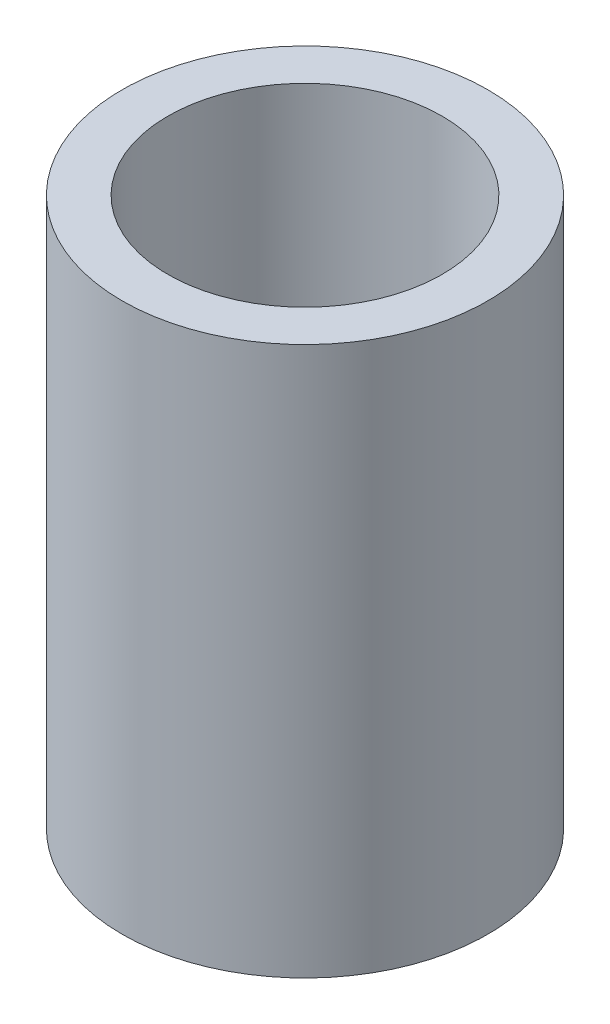
ISO-10303-21;
HEADER;
FILE_DESCRIPTION(('STEP AP214'),'2;1');
FILE_NAME('part.step','',(''),(''),'','','');
FILE_SCHEMA(('AUTOMOTIVE_DESIGN { 1 0 10303 214 1 1 1 1 }'));
ENDSEC;
DATA;
#1=APPLICATION_CONTEXT('core data for automotive mechanical design processes');
#2=APPLICATION_PROTOCOL_DEFINITION('international standard','automotive_design',2000,#1);
#3=PRODUCT_CONTEXT('',#1,'mechanical');
#4=PRODUCT('Part','Part','',(#3));
#5=PRODUCT_RELATED_PRODUCT_CATEGORY('part','',(#4));
#6=PRODUCT_DEFINITION_FORMATION('','',#4);
#7=PRODUCT_DEFINITION_CONTEXT('part definition',#1,'design');
#8=PRODUCT_DEFINITION('design','',#6,#7);
#9=PRODUCT_DEFINITION_SHAPE('','',#8);
#10=(LENGTH_UNIT() NAMED_UNIT(*) SI_UNIT(.MILLI.,.METRE.));
#11=(NAMED_UNIT(*) PLANE_ANGLE_UNIT() SI_UNIT($,.RADIAN.));
#12=(NAMED_UNIT(*) SI_UNIT($,.STERADIAN.) SOLID_ANGLE_UNIT());
#13=UNCERTAINTY_MEASURE_WITH_UNIT(LENGTH_MEASURE(1.E-05),#10,'distance_accuracy_value','');
#14=(GEOMETRIC_REPRESENTATION_CONTEXT(3) GLOBAL_UNCERTAINTY_ASSIGNED_CONTEXT((#13)) GLOBAL_UNIT_ASSIGNED_CONTEXT((#10,
#11,#12)) REPRESENTATION_CONTEXT('',''));
#15=CARTESIAN_POINT('',(0.,0.,0.));
#16=DIRECTION('',(0.,0.,1.));
#17=DIRECTION('',(1.,0.,0.));
#18=AXIS2_PLACEMENT_3D('',#15,#16,#17);
#19=CARTESIAN_POINT('',(0.,38.1,0.));
#20=DIRECTION('',(0.,1.,0.));
#21=DIRECTION('',(0.,0.,1.));
#22=AXIS2_PLACEMENT_3D('',#19,#20,#21);
#23=PLANE('',#22);
#24=CARTESIAN_POINT('',(0.,38.1,0.));
#25=DIRECTION('',(0.,1.,0.));
#26=DIRECTION('',(0.,0.,1.));
#27=AXIS2_PLACEMENT_3D('',#24,#25,#26);
#28=CIRCLE('',#27,12.7);
#29=CARTESIAN_POINT('',(0.,38.1,-12.7));
#30=VERTEX_POINT('',#29);
#31=EDGE_CURVE('E10',#30,#30,#28,.T.);
#32=ORIENTED_EDGE('',*,*,#31,.T.);
#33=EDGE_LOOP('',(#32));
#34=FACE_BOUND('',#33,.T.);
#35=CARTESIAN_POINT('',(0.,38.1,0.));
#36=DIRECTION('',(0.,1.,0.));
#37=DIRECTION('',(0.,0.,1.));
#38=AXIS2_PLACEMENT_3D('',#35,#36,#37);
#39=CIRCLE('',#38,9.52500000000002);
#40=CARTESIAN_POINT('',(0.,38.1,-9.52500000000002));
#41=VERTEX_POINT('',#40);
#42=EDGE_CURVE('E43',#41,#41,#39,.T.);
#43=ORIENTED_EDGE('',*,*,#42,.F.);
#44=EDGE_LOOP('',(#43));
#45=FACE_BOUND('',#44,.T.);
#46=ADVANCED_FACE('F32',(#34,#45),#23,.T.);
#47=CARTESIAN_POINT('',(0.,0.,0.));
#48=DIRECTION('',(0.,1.,0.));
#49=DIRECTION('',(0.,0.,1.));
#50=AXIS2_PLACEMENT_3D('',#47,#48,#49);
#51=PLANE('',#50);
#52=CARTESIAN_POINT('',(0.,0.,0.));
#53=DIRECTION('',(0.,1.,0.));
#54=DIRECTION('',(0.,0.,1.));
#55=AXIS2_PLACEMENT_3D('',#52,#53,#54);
#56=CIRCLE('',#55,12.7);
#57=CARTESIAN_POINT('',(0.,0.,-12.7));
#58=VERTEX_POINT('',#57);
#59=EDGE_CURVE('E36',#58,#58,#56,.T.);
#60=ORIENTED_EDGE('',*,*,#59,.F.);
#61=EDGE_LOOP('',(#60));
#62=FACE_BOUND('',#61,.T.);
#63=CARTESIAN_POINT('',(0.,0.,0.));
#64=DIRECTION('',(0.,1.,0.));
#65=DIRECTION('',(0.,0.,1.));
#66=AXIS2_PLACEMENT_3D('',#63,#64,#65);
#67=CIRCLE('',#66,9.52500000000002);
#68=CARTESIAN_POINT('',(0.,0.,-9.52500000000002));
#69=VERTEX_POINT('',#68);
#70=EDGE_CURVE('E45',#69,#69,#67,.T.);
#71=ORIENTED_EDGE('',*,*,#70,.T.);
#72=EDGE_LOOP('',(#71));
#73=FACE_BOUND('',#72,.T.);
#74=ADVANCED_FACE('F55',(#62,#73),#51,.F.);
#75=CARTESIAN_POINT('',(0.,38.1,0.));
#76=DIRECTION('',(0.,-1.,0.));
#77=DIRECTION('',(0.,0.,-1.));
#78=AXIS2_PLACEMENT_3D('',#75,#76,#77);
#79=CYLINDRICAL_SURFACE('',#78,12.7);
#80=CARTESIAN_POINT('',(0.,38.1,-12.7));
#81=CARTESIAN_POINT('',(0.,37.703125,-12.7));
#82=CARTESIAN_POINT('',(0.,37.30625,-12.7));
#83=CARTESIAN_POINT('',(0.,36.5125,-12.7));
#84=CARTESIAN_POINT('',(0.,36.115625,-12.7));
#85=CARTESIAN_POINT('',(0.,35.321875,-12.7));
#86=CARTESIAN_POINT('',(0.,34.925,-12.7));
#87=CARTESIAN_POINT('',(0.,34.13125,-12.7));
#88=CARTESIAN_POINT('',(0.,33.734375,-12.7));
#89=CARTESIAN_POINT('',(0.,32.940625,-12.7));
#90=CARTESIAN_POINT('',(0.,32.54375,-12.7));
#91=CARTESIAN_POINT('',(0.,31.75,-12.7));
#92=CARTESIAN_POINT('',(0.,31.353125,-12.7));
#93=CARTESIAN_POINT('',(0.,30.559375,-12.7));
#94=CARTESIAN_POINT('',(0.,30.1625,-12.7));
#95=CARTESIAN_POINT('',(0.,29.36875,-12.7));
#96=CARTESIAN_POINT('',(0.,28.971875,-12.7));
#97=CARTESIAN_POINT('',(0.,28.178125,-12.7));
#98=CARTESIAN_POINT('',(0.,27.78125,-12.7));
#99=CARTESIAN_POINT('',(0.,26.9875,-12.7));
#100=CARTESIAN_POINT('',(0.,26.590625,-12.7));
#101=CARTESIAN_POINT('',(0.,25.796875,-12.7));
#102=CARTESIAN_POINT('',(0.,25.4,-12.7));
#103=CARTESIAN_POINT('',(0.,24.60625,-12.7));
#104=CARTESIAN_POINT('',(0.,24.209375,-12.7));
#105=CARTESIAN_POINT('',(0.,23.415625,-12.7));
#106=CARTESIAN_POINT('',(0.,23.01875,-12.7));
#107=CARTESIAN_POINT('',(0.,22.225,-12.7));
#108=CARTESIAN_POINT('',(0.,21.828125,-12.7));
#109=CARTESIAN_POINT('',(0.,21.034375,-12.7));
#110=CARTESIAN_POINT('',(0.,20.6375,-12.7));
#111=CARTESIAN_POINT('',(0.,19.84375,-12.7));
#112=CARTESIAN_POINT('',(0.,19.446875,-12.7));
#113=CARTESIAN_POINT('',(0.,18.653125,-12.7));
#114=CARTESIAN_POINT('',(0.,18.25625,-12.7));
#115=CARTESIAN_POINT('',(0.,17.4625,-12.7));
#116=CARTESIAN_POINT('',(0.,17.065625,-12.7));
#117=CARTESIAN_POINT('',(0.,16.271875,-12.7));
#118=CARTESIAN_POINT('',(0.,15.875,-12.7));
#119=CARTESIAN_POINT('',(0.,15.08125,-12.7));
#120=CARTESIAN_POINT('',(0.,14.684375,-12.7));
#121=CARTESIAN_POINT('',(0.,13.890625,-12.7));
#122=CARTESIAN_POINT('',(0.,13.49375,-12.7));
#123=CARTESIAN_POINT('',(0.,12.7,-12.7));
#124=CARTESIAN_POINT('',(0.,12.303125,-12.7));
#125=CARTESIAN_POINT('',(0.,11.509375,-12.7));
#126=CARTESIAN_POINT('',(0.,11.1125,-12.7));
#127=CARTESIAN_POINT('',(0.,10.31875,-12.7));
#128=CARTESIAN_POINT('',(0.,9.92187499999999,-12.7));
#129=CARTESIAN_POINT('',(0.,9.128125,-12.7));
#130=CARTESIAN_POINT('',(0.,8.73124999999999,-12.7));
#131=CARTESIAN_POINT('',(0.,7.93749999999999,-12.7));
#132=CARTESIAN_POINT('',(0.,7.54062499999999,-12.7));
#133=CARTESIAN_POINT('',(0.,6.746875,-12.7));
#134=CARTESIAN_POINT('',(0.,6.35,-12.7));
#135=CARTESIAN_POINT('',(0.,5.55625,-12.7));
#136=CARTESIAN_POINT('',(0.,5.159375,-12.7));
#137=CARTESIAN_POINT('',(0.,4.365625,-12.7));
#138=CARTESIAN_POINT('',(0.,3.96875,-12.7));
#139=CARTESIAN_POINT('',(0.,3.175,-12.7));
#140=CARTESIAN_POINT('',(0.,2.778125,-12.7));
#141=CARTESIAN_POINT('',(0.,1.984375,-12.7));
#142=CARTESIAN_POINT('',(0.,1.5875,-12.7));
#143=CARTESIAN_POINT('',(0.,0.79375,-12.7));
#144=CARTESIAN_POINT('',(0.,0.396875,-12.7));
#145=CARTESIAN_POINT('',(0.,0.,-12.7));
#146=B_SPLINE_CURVE_WITH_KNOTS('',3,(#80,#81,#82,#83,#84,#85,#86,#87,#88,#89,#90,#91,#92,#93,
#94,#95,#96,#97,#98,#99,#100,#101,#102,#103,#104,#105,#106,#107,#108,#109,#110,#111,#112,#113,
#114,#115,#116,#117,#118,#119,#120,#121,#122,#123,#124,#125,#126,#127,#128,#129,#130,#131,#132,
#133,#134,#135,#136,#137,#138,#139,#140,#141,#142,#143,#144,#145),.UNSPECIFIED.,.F.,.F.,(4,2,2,
2,2,2,2,2,2,2,2,2,2,2,2,2,2,2,2,2,2,2,2,2,2,2,2,2,2,2,2,2,4),(0.,1.190625,2.38125,3.571875,
4.7625,5.953125,7.14375,8.334375,9.52500000000001,10.715625,11.90625,13.096875,14.2875,
15.478125,16.66875,17.859375,19.05,20.240625,21.43125,22.621875,23.8125,25.003125,26.19375,
27.384375,28.575,29.765625,30.95625,32.146875,33.3375,34.528125,35.71875,36.909375,38.1),.UNSPECIFIED.);
#147=EDGE_CURVE('BSEAM34',#30,#58,#146,.T.);
#148=ORIENTED_EDGE('',*,*,#31,.F.);
#149=ORIENTED_EDGE('',*,*,#59,.T.);
#150=ORIENTED_EDGE('',*,*,#147,.T.);
#151=ORIENTED_EDGE('',*,*,#147,.F.);
#152=EDGE_LOOP('',(#148,#150,#149,#151));
#153=FACE_BOUND('',#152,.T.);
#154=ADVANCED_FACE('F34',(#153),#79,.T.);
#155=CARTESIAN_POINT('',(0.,38.1,0.));
#156=DIRECTION('',(0.,-1.,0.));
#157=DIRECTION('',(0.,0.,-1.));
#158=AXIS2_PLACEMENT_3D('',#155,#156,#157);
#159=CYLINDRICAL_SURFACE('',#158,9.52500000000002);
#160=CARTESIAN_POINT('',(0.,38.1,-9.52500000000002));
#161=CARTESIAN_POINT('',(0.,37.703125,-9.52500000000002));
#162=CARTESIAN_POINT('',(0.,37.30625,-9.52500000000002));
#163=CARTESIAN_POINT('',(0.,36.5125,-9.52500000000002));
#164=CARTESIAN_POINT('',(0.,36.115625,-9.52500000000002));
#165=CARTESIAN_POINT('',(0.,35.321875,-9.52500000000002));
#166=CARTESIAN_POINT('',(0.,34.925,-9.52500000000002));
#167=CARTESIAN_POINT('',(0.,34.13125,-9.52500000000002));
#168=CARTESIAN_POINT('',(0.,33.734375,-9.52500000000002));
#169=CARTESIAN_POINT('',(0.,32.940625,-9.52500000000002));
#170=CARTESIAN_POINT('',(0.,32.54375,-9.52500000000002));
#171=CARTESIAN_POINT('',(0.,31.75,-9.52500000000002));
#172=CARTESIAN_POINT('',(0.,31.353125,-9.52500000000002));
#173=CARTESIAN_POINT('',(0.,30.559375,-9.52500000000002));
#174=CARTESIAN_POINT('',(0.,30.1625,-9.52500000000002));
#175=CARTESIAN_POINT('',(0.,29.36875,-9.52500000000002));
#176=CARTESIAN_POINT('',(0.,28.971875,-9.52500000000002));
#177=CARTESIAN_POINT('',(0.,28.178125,-9.52500000000002));
#178=CARTESIAN_POINT('',(0.,27.78125,-9.52500000000002));
#179=CARTESIAN_POINT('',(0.,26.9875,-9.52500000000002));
#180=CARTESIAN_POINT('',(0.,26.590625,-9.52500000000002));
#181=CARTESIAN_POINT('',(0.,25.796875,-9.52500000000002));
#182=CARTESIAN_POINT('',(0.,25.4,-9.52500000000002));
#183=CARTESIAN_POINT('',(0.,24.60625,-9.52500000000002));
#184=CARTESIAN_POINT('',(0.,24.209375,-9.52500000000002));
#185=CARTESIAN_POINT('',(0.,23.415625,-9.52500000000002));
#186=CARTESIAN_POINT('',(0.,23.01875,-9.52500000000002));
#187=CARTESIAN_POINT('',(0.,22.225,-9.52500000000002));
#188=CARTESIAN_POINT('',(0.,21.828125,-9.52500000000002));
#189=CARTESIAN_POINT('',(0.,21.034375,-9.52500000000002));
#190=CARTESIAN_POINT('',(0.,20.6375,-9.52500000000002));
#191=CARTESIAN_POINT('',(0.,19.84375,-9.52500000000002));
#192=CARTESIAN_POINT('',(0.,19.446875,-9.52500000000002));
#193=CARTESIAN_POINT('',(0.,18.653125,-9.52500000000002));
#194=CARTESIAN_POINT('',(0.,18.25625,-9.52500000000002));
#195=CARTESIAN_POINT('',(0.,17.4625,-9.52500000000002));
#196=CARTESIAN_POINT('',(0.,17.065625,-9.52500000000002));
#197=CARTESIAN_POINT('',(0.,16.271875,-9.52500000000002));
#198=CARTESIAN_POINT('',(0.,15.875,-9.52500000000002));
#199=CARTESIAN_POINT('',(0.,15.08125,-9.52500000000002));
#200=CARTESIAN_POINT('',(0.,14.684375,-9.52500000000002));
#201=CARTESIAN_POINT('',(0.,13.890625,-9.52500000000002));
#202=CARTESIAN_POINT('',(0.,13.49375,-9.52500000000002));
#203=CARTESIAN_POINT('',(0.,12.7,-9.52500000000002));
#204=CARTESIAN_POINT('',(0.,12.303125,-9.52500000000002));
#205=CARTESIAN_POINT('',(0.,11.509375,-9.52500000000002));
#206=CARTESIAN_POINT('',(0.,11.1125,-9.52500000000002));
#207=CARTESIAN_POINT('',(0.,10.31875,-9.52500000000002));
#208=CARTESIAN_POINT('',(0.,9.92187499999999,-9.52500000000002));
#209=CARTESIAN_POINT('',(0.,9.128125,-9.52500000000002));
#210=CARTESIAN_POINT('',(0.,8.73124999999999,-9.52500000000002));
#211=CARTESIAN_POINT('',(0.,7.93749999999999,-9.52500000000002));
#212=CARTESIAN_POINT('',(0.,7.54062499999999,-9.52500000000002));
#213=CARTESIAN_POINT('',(0.,6.746875,-9.52500000000002));
#214=CARTESIAN_POINT('',(0.,6.35,-9.52500000000002));
#215=CARTESIAN_POINT('',(0.,5.55625,-9.52500000000002));
#216=CARTESIAN_POINT('',(0.,5.159375,-9.52500000000002));
#217=CARTESIAN_POINT('',(0.,4.365625,-9.52500000000002));
#218=CARTESIAN_POINT('',(0.,3.96875,-9.52500000000002));
#219=CARTESIAN_POINT('',(0.,3.175,-9.52500000000002));
#220=CARTESIAN_POINT('',(0.,2.778125,-9.52500000000002));
#221=CARTESIAN_POINT('',(0.,1.984375,-9.52500000000002));
#222=CARTESIAN_POINT('',(0.,1.5875,-9.52500000000002));
#223=CARTESIAN_POINT('',(0.,0.79375,-9.52500000000002));
#224=CARTESIAN_POINT('',(0.,0.396875,-9.52500000000002));
#225=CARTESIAN_POINT('',(0.,0.,-9.52500000000002));
#226=B_SPLINE_CURVE_WITH_KNOTS('',3,(#160,#161,#162,#163,#164,#165,#166,#167,#168,#169,#170,
#171,#172,#173,#174,#175,#176,#177,#178,#179,#180,#181,#182,#183,#184,#185,#186,#187,#188,#189,
#190,#191,#192,#193,#194,#195,#196,#197,#198,#199,#200,#201,#202,#203,#204,#205,#206,#207,#208,
#209,#210,#211,#212,#213,#214,#215,#216,#217,#218,#219,#220,#221,#222,#223,#224,#225),
.UNSPECIFIED.,.F.,.F.,(4,2,2,2,2,2,2,2,2,2,2,2,2,2,2,2,2,2,2,2,2,2,2,2,2,2,2,2,2,2,2,2,4),(0.,
1.190625,2.38125,3.571875,4.7625,5.953125,7.14375,8.334375,9.52500000000001,10.715625,11.90625,
13.096875,14.2875,15.478125,16.66875,17.859375,19.05,20.240625,21.43125,22.621875,23.8125,
25.003125,26.19375,27.384375,28.575,29.765625,30.95625,32.146875,33.3375,34.528125,35.71875,
36.909375,38.1),.UNSPECIFIED.);
#227=EDGE_CURVE('BSEAM51',#41,#69,#226,.T.);
#228=ORIENTED_EDGE('',*,*,#42,.T.);
#229=ORIENTED_EDGE('',*,*,#70,.F.);
#230=ORIENTED_EDGE('',*,*,#227,.T.);
#231=ORIENTED_EDGE('',*,*,#227,.F.);
#232=EDGE_LOOP('',(#228,#230,#229,#231));
#233=FACE_BOUND('',#232,.T.);
#234=ADVANCED_FACE('F51',(#233),#159,.F.);
#235=CLOSED_SHELL('',(#46,#74,#154,#234));
#236=MANIFOLD_SOLID_BREP('B2',#235);
#237=ADVANCED_BREP_SHAPE_REPRESENTATION('',(#18,#236),#14);
#238=SHAPE_DEFINITION_REPRESENTATION(#9,#237);
ENDSEC;
END-ISO-10303-21;
